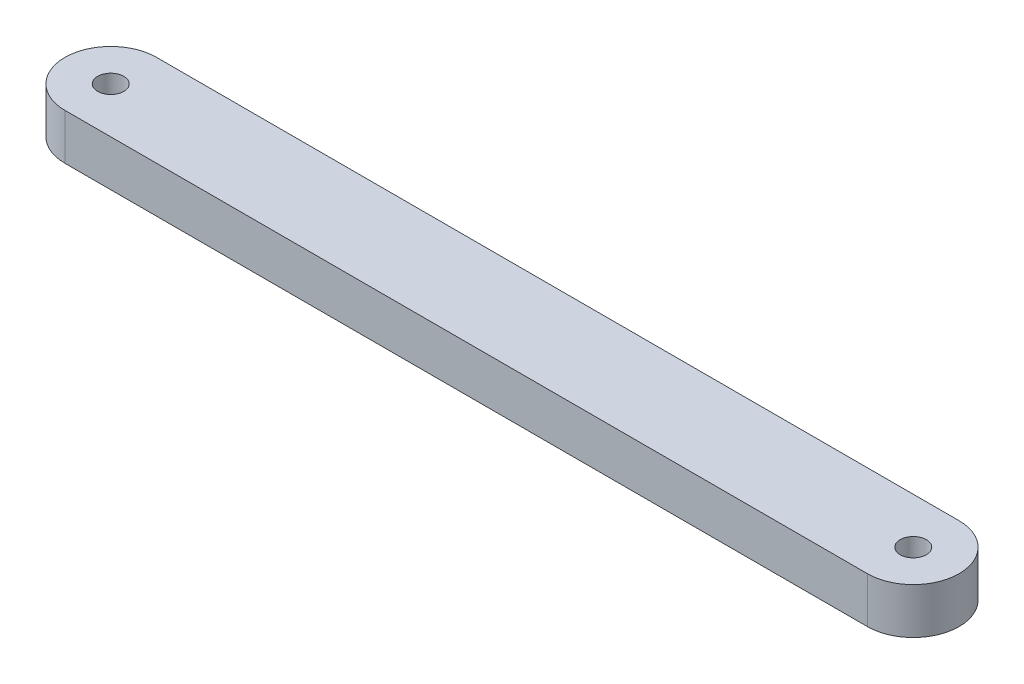
ISO-10303-21;
HEADER;
FILE_DESCRIPTION(('STEP AP214'),'2;1');
FILE_NAME('part.step','',(''),(''),'','','');
FILE_SCHEMA(('AUTOMOTIVE_DESIGN { 1 0 10303 214 1 1 1 1 }'));
ENDSEC;
DATA;
#1=APPLICATION_CONTEXT('core data for automotive mechanical design processes');
#2=APPLICATION_PROTOCOL_DEFINITION('international standard','automotive_design',2000,#1);
#3=PRODUCT_CONTEXT('',#1,'mechanical');
#4=PRODUCT('Part','Part','',(#3));
#5=PRODUCT_RELATED_PRODUCT_CATEGORY('part','',(#4));
#6=PRODUCT_DEFINITION_FORMATION('','',#4);
#7=PRODUCT_DEFINITION_CONTEXT('part definition',#1,'design');
#8=PRODUCT_DEFINITION('design','',#6,#7);
#9=PRODUCT_DEFINITION_SHAPE('','',#8);
#10=(LENGTH_UNIT() NAMED_UNIT(*) SI_UNIT(.MILLI.,.METRE.));
#11=(NAMED_UNIT(*) PLANE_ANGLE_UNIT() SI_UNIT($,.RADIAN.));
#12=(NAMED_UNIT(*) SI_UNIT($,.STERADIAN.) SOLID_ANGLE_UNIT());
#13=UNCERTAINTY_MEASURE_WITH_UNIT(LENGTH_MEASURE(1.E-05),#10,'distance_accuracy_value','');
#14=(GEOMETRIC_REPRESENTATION_CONTEXT(3) GLOBAL_UNCERTAINTY_ASSIGNED_CONTEXT((#13)) GLOBAL_UNIT_ASSIGNED_CONTEXT((#10,
#11,#12)) REPRESENTATION_CONTEXT('',''));
#15=CARTESIAN_POINT('',(0.,0.,0.));
#16=DIRECTION('',(0.,0.,1.));
#17=DIRECTION('',(1.,0.,0.));
#18=AXIS2_PLACEMENT_3D('',#15,#16,#17);
#19=CARTESIAN_POINT('',(-44.45,5.08,0.));
#20=DIRECTION('',(0.,1.,0.));
#21=DIRECTION('',(0.,0.,1.));
#22=AXIS2_PLACEMENT_3D('',#19,#20,#21);
#23=PLANE('',#22);
#24=CARTESIAN_POINT('',(-44.45,5.08,0.));
#25=DIRECTION('',(0.,1.,0.));
#26=DIRECTION('',(0.,0.,1.));
#27=AXIS2_PLACEMENT_3D('',#24,#25,#26);
#28=CIRCLE('',#27,1.45);
#29=CARTESIAN_POINT('',(-44.45,5.08,1.45));
#30=VERTEX_POINT('',#29);
#31=EDGE_CURVE('E116',#30,#30,#28,.T.);
#32=ORIENTED_EDGE('',*,*,#31,.F.);
#33=EDGE_LOOP('',(#32));
#34=FACE_BOUND('',#33,.T.);
#35=CARTESIAN_POINT('',(-44.45,5.08,0.));
#36=DIRECTION('',(0.,1.,0.));
#37=DIRECTION('',(0.,0.,1.));
#38=AXIS2_PLACEMENT_3D('',#35,#36,#37);
#39=CIRCLE('',#38,5.08);
#40=CARTESIAN_POINT('',(-44.45,5.08,-5.08));
#41=VERTEX_POINT('',#40);
#42=CARTESIAN_POINT('',(-44.45,5.08,5.08));
#43=VERTEX_POINT('',#42);
#44=EDGE_CURVE('E96',#41,#43,#39,.T.);
#45=ORIENTED_EDGE('',*,*,#44,.T.);
#46=DIRECTION('',(1.,0.,0.));
#47=VECTOR('',#46,1.);
#48=CARTESIAN_POINT('',(-44.45,5.08,5.08));
#49=LINE('',#48,#47);
#50=CARTESIAN_POINT('',(44.45,5.08,5.08));
#51=VERTEX_POINT('',#50);
#52=EDGE_CURVE('E91',#43,#51,#49,.T.);
#53=ORIENTED_EDGE('',*,*,#52,.T.);
#54=CARTESIAN_POINT('',(44.45,5.08,0.));
#55=DIRECTION('',(0.,1.,0.));
#56=DIRECTION('',(0.,0.,-1.));
#57=AXIS2_PLACEMENT_3D('',#54,#55,#56);
#58=CIRCLE('',#57,5.08);
#59=CARTESIAN_POINT('',(44.45,5.08,-5.08));
#60=VERTEX_POINT('',#59);
#61=EDGE_CURVE('E94',#51,#60,#58,.T.);
#62=ORIENTED_EDGE('',*,*,#61,.T.);
#63=DIRECTION('',(-1.,0.,0.));
#64=VECTOR('',#63,1.);
#65=CARTESIAN_POINT('',(-44.45,5.08,-5.08));
#66=LINE('',#65,#64);
#67=EDGE_CURVE('E61',#60,#41,#66,.T.);
#68=ORIENTED_EDGE('',*,*,#67,.T.);
#69=EDGE_LOOP('',(#45,#53,#62,#68));
#70=FACE_BOUND('',#69,.T.);
#71=CARTESIAN_POINT('',(44.45,5.08,0.));
#72=DIRECTION('',(0.,1.,0.));
#73=DIRECTION('',(0.,0.,1.));
#74=AXIS2_PLACEMENT_3D('',#71,#72,#73);
#75=CIRCLE('',#74,1.45);
#76=CARTESIAN_POINT('',(44.45,5.08,1.45));
#77=VERTEX_POINT('',#76);
#78=EDGE_CURVE('E138',#77,#77,#75,.T.);
#79=ORIENTED_EDGE('',*,*,#78,.F.);
#80=EDGE_LOOP('',(#79));
#81=FACE_BOUND('',#80,.T.);
#82=ADVANCED_FACE('F43',(#34,#70,#81),#23,.T.);
#83=CARTESIAN_POINT('',(-44.45,0.,0.));
#84=DIRECTION('',(0.,1.,0.));
#85=DIRECTION('',(0.,0.,1.));
#86=AXIS2_PLACEMENT_3D('',#83,#84,#85);
#87=PLANE('',#86);
#88=CARTESIAN_POINT('',(-44.45,0.,0.));
#89=DIRECTION('',(0.,1.,0.));
#90=DIRECTION('',(0.,0.,1.));
#91=AXIS2_PLACEMENT_3D('',#88,#89,#90);
#92=CIRCLE('',#91,5.08);
#93=CARTESIAN_POINT('',(-44.45,0.,-5.08));
#94=VERTEX_POINT('',#93);
#95=CARTESIAN_POINT('',(-44.45,0.,5.08));
#96=VERTEX_POINT('',#95);
#97=EDGE_CURVE('E112',#94,#96,#92,.T.);
#98=ORIENTED_EDGE('',*,*,#97,.F.);
#99=DIRECTION('',(-1.,0.,0.));
#100=VECTOR('',#99,1.);
#101=CARTESIAN_POINT('',(-44.45,0.,-5.08));
#102=LINE('',#101,#100);
#103=CARTESIAN_POINT('',(44.45,0.,-5.08));
#104=VERTEX_POINT('',#103);
#105=EDGE_CURVE('E84',#104,#94,#102,.T.);
#106=ORIENTED_EDGE('',*,*,#105,.F.);
#107=CARTESIAN_POINT('',(44.45,0.,0.));
#108=DIRECTION('',(0.,1.,0.));
#109=DIRECTION('',(0.,0.,-1.));
#110=AXIS2_PLACEMENT_3D('',#107,#108,#109);
#111=CIRCLE('',#110,5.08);
#112=CARTESIAN_POINT('',(44.45,0.,5.08));
#113=VERTEX_POINT('',#112);
#114=EDGE_CURVE('E78',#113,#104,#111,.T.);
#115=ORIENTED_EDGE('',*,*,#114,.F.);
#116=DIRECTION('',(1.,0.,0.));
#117=VECTOR('',#116,1.);
#118=CARTESIAN_POINT('',(-44.45,0.,5.08));
#119=LINE('',#118,#117);
#120=EDGE_CURVE('E101',#96,#113,#119,.T.);
#121=ORIENTED_EDGE('',*,*,#120,.F.);
#122=EDGE_LOOP('',(#98,#106,#115,#121));
#123=FACE_BOUND('',#122,.T.);
#124=CARTESIAN_POINT('',(-44.45,0.,0.));
#125=DIRECTION('',(0.,1.,0.));
#126=DIRECTION('',(0.,0.,1.));
#127=AXIS2_PLACEMENT_3D('',#124,#125,#126);
#128=CIRCLE('',#127,1.45);
#129=CARTESIAN_POINT('',(-44.45,0.,1.45));
#130=VERTEX_POINT('',#129);
#131=EDGE_CURVE('E134',#130,#130,#128,.T.);
#132=ORIENTED_EDGE('',*,*,#131,.T.);
#133=EDGE_LOOP('',(#132));
#134=FACE_BOUND('',#133,.T.);
#135=CARTESIAN_POINT('',(44.45,0.,0.));
#136=DIRECTION('',(0.,1.,0.));
#137=DIRECTION('',(0.,0.,1.));
#138=AXIS2_PLACEMENT_3D('',#135,#136,#137);
#139=CIRCLE('',#138,1.45);
#140=CARTESIAN_POINT('',(44.45,0.,1.45));
#141=VERTEX_POINT('',#140);
#142=EDGE_CURVE('E142',#141,#141,#139,.T.);
#143=ORIENTED_EDGE('',*,*,#142,.T.);
#144=EDGE_LOOP('',(#143));
#145=FACE_BOUND('',#144,.T.);
#146=ADVANCED_FACE('F129',(#123,#134,#145),#87,.F.);
#147=CARTESIAN_POINT('',(-44.45,5.08,0.));
#148=DIRECTION('',(0.,-1.,0.));
#149=DIRECTION('',(0.,0.,-1.));
#150=AXIS2_PLACEMENT_3D('',#147,#148,#149);
#151=CYLINDRICAL_SURFACE('',#150,5.08);
#152=ORIENTED_EDGE('',*,*,#97,.T.);
#153=DIRECTION('',(0.,-1.,0.));
#154=VECTOR('',#153,1.);
#155=CARTESIAN_POINT('',(-44.45,5.08,5.08));
#156=LINE('',#155,#154);
#157=EDGE_CURVE('E11',#43,#96,#156,.T.);
#158=ORIENTED_EDGE('',*,*,#157,.F.);
#159=ORIENTED_EDGE('',*,*,#44,.F.);
#160=DIRECTION('',(0.,-1.,0.));
#161=VECTOR('',#160,1.);
#162=CARTESIAN_POINT('',(-44.45,5.08,-5.08));
#163=LINE('',#162,#161);
#164=EDGE_CURVE('E108',#41,#94,#163,.T.);
#165=ORIENTED_EDGE('',*,*,#164,.T.);
#166=EDGE_LOOP('',(#152,#158,#159,#165));
#167=FACE_BOUND('',#166,.T.);
#168=ADVANCED_FACE('F45',(#167),#151,.T.);
#169=CARTESIAN_POINT('',(-44.45,5.08,5.08));
#170=DIRECTION('',(0.,0.,-1.));
#171=DIRECTION('',(-1.,0.,0.));
#172=AXIS2_PLACEMENT_3D('',#169,#170,#171);
#173=PLANE('',#172);
#174=ORIENTED_EDGE('',*,*,#120,.T.);
#175=DIRECTION('',(0.,-1.,0.));
#176=VECTOR('',#175,1.);
#177=CARTESIAN_POINT('',(44.45,5.08,5.08));
#178=LINE('',#177,#176);
#179=EDGE_CURVE('E53',#51,#113,#178,.T.);
#180=ORIENTED_EDGE('',*,*,#179,.F.);
#181=ORIENTED_EDGE('',*,*,#52,.F.);
#182=ORIENTED_EDGE('',*,*,#157,.T.);
#183=EDGE_LOOP('',(#174,#180,#181,#182));
#184=FACE_BOUND('',#183,.T.);
#185=ADVANCED_FACE('F100',(#184),#173,.F.);
#186=CARTESIAN_POINT('',(44.45,5.08,0.));
#187=DIRECTION('',(0.,-1.,0.));
#188=DIRECTION('',(0.,0.,-1.));
#189=AXIS2_PLACEMENT_3D('',#186,#187,#188);
#190=CYLINDRICAL_SURFACE('',#189,5.08);
#191=ORIENTED_EDGE('',*,*,#114,.T.);
#192=DIRECTION('',(0.,-1.,0.));
#193=VECTOR('',#192,1.);
#194=CARTESIAN_POINT('',(44.45,5.08,-5.08));
#195=LINE('',#194,#193);
#196=EDGE_CURVE('E103',#60,#104,#195,.T.);
#197=ORIENTED_EDGE('',*,*,#196,.F.);
#198=ORIENTED_EDGE('',*,*,#61,.F.);
#199=ORIENTED_EDGE('',*,*,#179,.T.);
#200=EDGE_LOOP('',(#191,#197,#198,#199));
#201=FACE_BOUND('',#200,.T.);
#202=ADVANCED_FACE('F104',(#201),#190,.T.);
#203=CARTESIAN_POINT('',(-44.45,5.08,-5.08));
#204=DIRECTION('',(0.,0.,1.));
#205=DIRECTION('',(1.,0.,0.));
#206=AXIS2_PLACEMENT_3D('',#203,#204,#205);
#207=PLANE('',#206);
#208=ORIENTED_EDGE('',*,*,#105,.T.);
#209=ORIENTED_EDGE('',*,*,#164,.F.);
#210=ORIENTED_EDGE('',*,*,#67,.F.);
#211=ORIENTED_EDGE('',*,*,#196,.T.);
#212=EDGE_LOOP('',(#208,#209,#210,#211));
#213=FACE_BOUND('',#212,.T.);
#214=ADVANCED_FACE('F126',(#213),#207,.F.);
#215=CARTESIAN_POINT('',(-44.45,5.08,0.));
#216=DIRECTION('',(0.,-1.,0.));
#217=DIRECTION('',(0.,0.,-1.));
#218=AXIS2_PLACEMENT_3D('',#215,#216,#217);
#219=CYLINDRICAL_SURFACE('',#218,1.45);
#220=ORIENTED_EDGE('',*,*,#31,.T.);
#221=EDGE_LOOP('',(#220));
#222=FACE_BOUND('',#221,.T.);
#223=ORIENTED_EDGE('',*,*,#131,.F.);
#224=EDGE_LOOP('',(#223));
#225=FACE_BOUND('',#224,.T.);
#226=ADVANCED_FACE('F161',(#222,#225),#219,.F.);
#227=CARTESIAN_POINT('',(44.45,5.08,0.));
#228=DIRECTION('',(0.,-1.,0.));
#229=DIRECTION('',(0.,0.,-1.));
#230=AXIS2_PLACEMENT_3D('',#227,#228,#229);
#231=CYLINDRICAL_SURFACE('',#230,1.45);
#232=ORIENTED_EDGE('',*,*,#78,.T.);
#233=EDGE_LOOP('',(#232));
#234=FACE_BOUND('',#233,.T.);
#235=ORIENTED_EDGE('',*,*,#142,.F.);
#236=EDGE_LOOP('',(#235));
#237=FACE_BOUND('',#236,.T.);
#238=ADVANCED_FACE('F150',(#234,#237),#231,.F.);
#239=CLOSED_SHELL('',(#82,#146,#168,#185,#202,#214,#226,#238));
#240=MANIFOLD_SOLID_BREP('B2',#239);
#241=ADVANCED_BREP_SHAPE_REPRESENTATION('',(#18,#240),#14);
#242=SHAPE_DEFINITION_REPRESENTATION(#9,#241);
ENDSEC;
END-ISO-10303-21;
